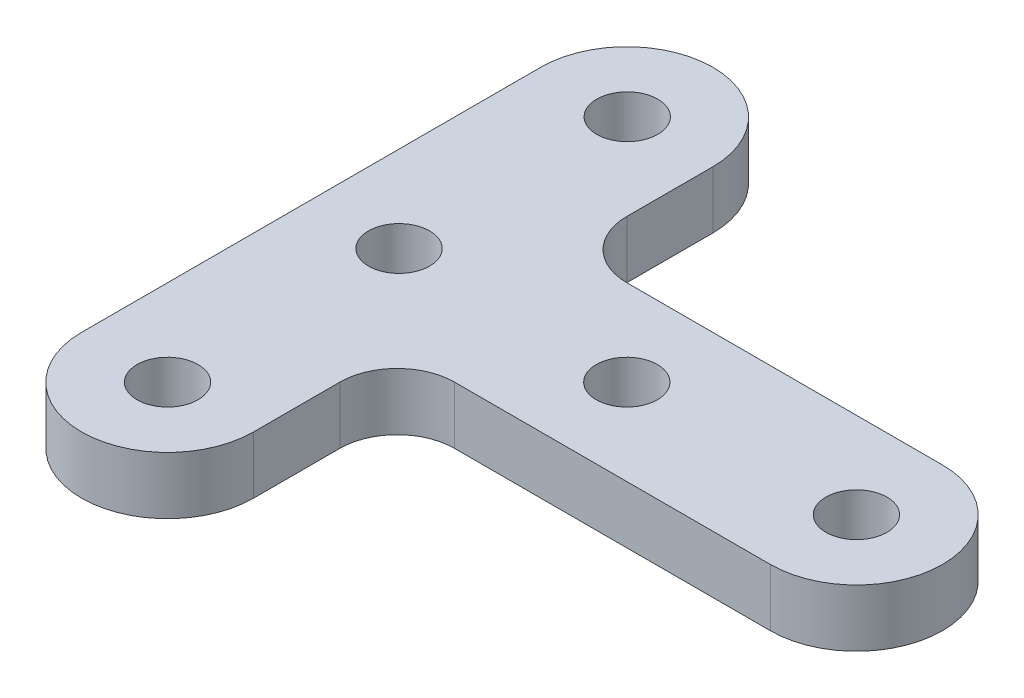
ISO-10303-21;
HEADER;
FILE_DESCRIPTION(('STEP AP214'),'2;1');
FILE_NAME('part.step','',(''),(''),'','','');
FILE_SCHEMA(('AUTOMOTIVE_DESIGN { 1 0 10303 214 1 1 1 1 }'));
ENDSEC;
DATA;
#1=APPLICATION_CONTEXT('core data for automotive mechanical design processes');
#2=APPLICATION_PROTOCOL_DEFINITION('international standard','automotive_design',2000,#1);
#3=PRODUCT_CONTEXT('',#1,'mechanical');
#4=PRODUCT('Part','Part','',(#3));
#5=PRODUCT_RELATED_PRODUCT_CATEGORY('part','',(#4));
#6=PRODUCT_DEFINITION_FORMATION('','',#4);
#7=PRODUCT_DEFINITION_CONTEXT('part definition',#1,'design');
#8=PRODUCT_DEFINITION('design','',#6,#7);
#9=PRODUCT_DEFINITION_SHAPE('','',#8);
#10=(LENGTH_UNIT() NAMED_UNIT(*) SI_UNIT(.MILLI.,.METRE.));
#11=(NAMED_UNIT(*) PLANE_ANGLE_UNIT() SI_UNIT($,.RADIAN.));
#12=(NAMED_UNIT(*) SI_UNIT($,.STERADIAN.) SOLID_ANGLE_UNIT());
#13=UNCERTAINTY_MEASURE_WITH_UNIT(LENGTH_MEASURE(1.E-05),#10,'distance_accuracy_value','');
#14=(GEOMETRIC_REPRESENTATION_CONTEXT(3) GLOBAL_UNCERTAINTY_ASSIGNED_CONTEXT((#13)) GLOBAL_UNIT_ASSIGNED_CONTEXT((#10,
#11,#12)) REPRESENTATION_CONTEXT('',''));
#15=CARTESIAN_POINT('',(0.,0.,0.));
#16=DIRECTION('',(0.,0.,1.));
#17=DIRECTION('',(1.,0.,0.));
#18=AXIS2_PLACEMENT_3D('',#15,#16,#17);
#19=CARTESIAN_POINT('',(-105.441812484,125.727574554,1122.100334154));
#20=DIRECTION('',(0.,0.,-1.));
#21=DIRECTION('',(1.,0.,0.));
#22=AXIS2_PLACEMENT_3D('',#19,#20,#21);
#23=PLANE('',#22);
#24=DIRECTION('',(1.,0.,0.));
#25=VECTOR('',#24,1.);
#26=CARTESIAN_POINT('',(-105.441812484,132.077574554,1122.100334154));
#27=LINE('',#26,#25);
#28=CARTESIAN_POINT('',(-99.0918124839999,132.077574554,1122.100334154));
#29=VERTEX_POINT('',#28);
#30=CARTESIAN_POINT('',(-64.1668124839999,132.077574554,1122.100334154));
#31=VERTEX_POINT('',#30);
#32=EDGE_CURVE('E219',#29,#31,#27,.T.);
#33=ORIENTED_EDGE('',*,*,#32,.F.);
#34=DIRECTION('',(0.,1.,0.));
#35=VECTOR('',#34,1.);
#36=CARTESIAN_POINT('',(-99.0918124839999,125.727574554,1122.100334154));
#37=LINE('',#36,#35);
#38=CARTESIAN_POINT('',(-99.0918124839999,125.727574554,1122.100334154));
#39=VERTEX_POINT('',#38);
#40=EDGE_CURVE('E54',#29,#39,#37,.F.);
#41=ORIENTED_EDGE('',*,*,#40,.T.);
#42=DIRECTION('',(1.,0.,0.));
#43=VECTOR('',#42,1.);
#44=CARTESIAN_POINT('',(-105.441812484,125.727574554,1122.100334154));
#45=LINE('',#44,#43);
#46=CARTESIAN_POINT('',(-64.1668124839999,125.727574554,1122.100334154));
#47=VERTEX_POINT('',#46);
#48=EDGE_CURVE('E112',#39,#47,#45,.T.);
#49=ORIENTED_EDGE('',*,*,#48,.T.);
#50=DIRECTION('',(0.,1.,0.));
#51=VECTOR('',#50,1.);
#52=CARTESIAN_POINT('',(-64.1668124839999,125.727574554,1122.100334154));
#53=LINE('',#52,#51);
#54=EDGE_CURVE('E115',#47,#31,#53,.T.);
#55=ORIENTED_EDGE('',*,*,#54,.T.);
#56=EDGE_LOOP('',(#33,#41,#49,#55));
#57=FACE_BOUND('',#56,.T.);
#58=ADVANCED_FACE('F39',(#57),#23,.F.);
#59=CARTESIAN_POINT('',(-64.1668124839999,125.727574554,1112.575334154));
#60=DIRECTION('',(0.,1.,0.));
#61=DIRECTION('',(0.,0.,1.));
#62=AXIS2_PLACEMENT_3D('',#59,#60,#61);
#63=CYLINDRICAL_SURFACE('',#62,9.52500000000001);
#64=CARTESIAN_POINT('',(-64.1668124839999,132.077574554,1112.575334154));
#65=DIRECTION('',(0.,1.,0.));
#66=DIRECTION('',(0.,0.,-1.));
#67=AXIS2_PLACEMENT_3D('',#64,#65,#66);
#68=CIRCLE('',#67,9.52500000000001);
#69=CARTESIAN_POINT('',(-64.1668124839999,132.077574554,1103.050334154));
#70=VERTEX_POINT('',#69);
#71=EDGE_CURVE('E132',#31,#70,#68,.T.);
#72=ORIENTED_EDGE('',*,*,#71,.F.);
#73=ORIENTED_EDGE('',*,*,#54,.F.);
#74=CARTESIAN_POINT('',(-64.1668124839999,125.727574554,1112.575334154));
#75=DIRECTION('',(0.,1.,0.));
#76=DIRECTION('',(0.,0.,-1.));
#77=AXIS2_PLACEMENT_3D('',#74,#75,#76);
#78=CIRCLE('',#77,9.52500000000001);
#79=CARTESIAN_POINT('',(-64.1668124839999,125.727574554,1103.050334154));
#80=VERTEX_POINT('',#79);
#81=EDGE_CURVE('E118',#47,#80,#78,.T.);
#82=ORIENTED_EDGE('',*,*,#81,.T.);
#83=DIRECTION('',(0.,1.,0.));
#84=VECTOR('',#83,1.);
#85=CARTESIAN_POINT('',(-64.1668124839999,125.727574554,1103.050334154));
#86=LINE('',#85,#84);
#87=EDGE_CURVE('E134',#80,#70,#86,.T.);
#88=ORIENTED_EDGE('',*,*,#87,.T.);
#89=EDGE_LOOP('',(#72,#73,#82,#88));
#90=FACE_BOUND('',#89,.T.);
#91=ADVANCED_FACE('F130',(#90),#63,.T.);
#92=CARTESIAN_POINT('',(-64.1668124839999,125.727574554,1103.050334154));
#93=DIRECTION('',(0.,0.,1.));
#94=DIRECTION('',(-1.,0.,0.));
#95=AXIS2_PLACEMENT_3D('',#92,#93,#94);
#96=PLANE('',#95);
#97=DIRECTION('',(-1.,0.,0.));
#98=VECTOR('',#97,1.);
#99=CARTESIAN_POINT('',(-64.1668124839999,125.727574554,1103.050334154));
#100=LINE('',#99,#98);
#101=CARTESIAN_POINT('',(-99.0918124839999,125.727574554,1103.050334154));
#102=VERTEX_POINT('',#101);
#103=EDGE_CURVE('E124',#80,#102,#100,.T.);
#104=ORIENTED_EDGE('',*,*,#103,.T.);
#105=DIRECTION('',(0.,1.,0.));
#106=VECTOR('',#105,1.);
#107=CARTESIAN_POINT('',(-99.0918124839999,132.077574554,1103.050334154));
#108=LINE('',#107,#106);
#109=CARTESIAN_POINT('',(-99.0918124839999,132.077574554,1103.050334154));
#110=VERTEX_POINT('',#109);
#111=EDGE_CURVE('E133',#102,#110,#108,.T.);
#112=ORIENTED_EDGE('',*,*,#111,.T.);
#113=DIRECTION('',(-1.,0.,0.));
#114=VECTOR('',#113,1.);
#115=CARTESIAN_POINT('',(-64.1668124839999,132.077574554,1103.050334154));
#116=LINE('',#115,#114);
#117=EDGE_CURVE('E168',#70,#110,#116,.T.);
#118=ORIENTED_EDGE('',*,*,#117,.F.);
#119=ORIENTED_EDGE('',*,*,#87,.F.);
#120=EDGE_LOOP('',(#104,#112,#118,#119));
#121=FACE_BOUND('',#120,.T.);
#122=ADVANCED_FACE('F159',(#121),#96,.F.);
#123=CARTESIAN_POINT('',(-105.441812484,125.727574554,1103.050334154));
#124=DIRECTION('',(-1.,0.,0.));
#125=DIRECTION('',(0.,0.,-1.));
#126=AXIS2_PLACEMENT_3D('',#123,#124,#125);
#127=PLANE('',#126);
#128=DIRECTION('',(0.,0.,-1.));
#129=VECTOR('',#128,1.);
#130=CARTESIAN_POINT('',(-105.441812484,132.077574554,1103.050334154));
#131=LINE('',#130,#129);
#132=CARTESIAN_POINT('',(-105.441812484,132.077574554,1096.700334154));
#133=VERTEX_POINT('',#132);
#134=CARTESIAN_POINT('',(-105.441812484,132.077574554,1087.175334154));
#135=VERTEX_POINT('',#134);
#136=EDGE_CURVE('E166',#133,#135,#131,.T.);
#137=ORIENTED_EDGE('',*,*,#136,.F.);
#138=DIRECTION('',(0.,1.,0.));
#139=VECTOR('',#138,1.);
#140=CARTESIAN_POINT('',(-105.441812484,125.727574554,1096.700334154));
#141=LINE('',#140,#139);
#142=CARTESIAN_POINT('',(-105.441812484,125.727574554,1096.700334154));
#143=VERTEX_POINT('',#142);
#144=EDGE_CURVE('E137',#133,#143,#141,.F.);
#145=ORIENTED_EDGE('',*,*,#144,.T.);
#146=DIRECTION('',(0.,0.,-1.));
#147=VECTOR('',#146,1.);
#148=CARTESIAN_POINT('',(-105.441812484,125.727574554,1103.050334154));
#149=LINE('',#148,#147);
#150=CARTESIAN_POINT('',(-105.441812484,125.727574554,1087.175334154));
#151=VERTEX_POINT('',#150);
#152=EDGE_CURVE('E154',#143,#151,#149,.T.);
#153=ORIENTED_EDGE('',*,*,#152,.T.);
#154=DIRECTION('',(0.,1.,0.));
#155=VECTOR('',#154,1.);
#156=CARTESIAN_POINT('',(-105.441812484,125.727574554,1087.175334154));
#157=LINE('',#156,#155);
#158=EDGE_CURVE('E139',#151,#135,#157,.T.);
#159=ORIENTED_EDGE('',*,*,#158,.T.);
#160=EDGE_LOOP('',(#137,#145,#153,#159));
#161=FACE_BOUND('',#160,.T.);
#162=ADVANCED_FACE('F171',(#161),#127,.F.);
#163=CARTESIAN_POINT('',(-114.966812484,125.727574554,1087.175334154));
#164=DIRECTION('',(0.,1.,0.));
#165=DIRECTION('',(0.,0.,1.));
#166=AXIS2_PLACEMENT_3D('',#163,#164,#165);
#167=CYLINDRICAL_SURFACE('',#166,9.52500000000006);
#168=CARTESIAN_POINT('',(-114.966812484,132.077574554,1087.175334154));
#169=DIRECTION('',(0.,1.,0.));
#170=DIRECTION('',(0.,0.,-1.));
#171=AXIS2_PLACEMENT_3D('',#168,#169,#170);
#172=CIRCLE('',#171,9.52500000000006);
#173=CARTESIAN_POINT('',(-124.491812484,132.077574554,1087.175334154));
#174=VERTEX_POINT('',#173);
#175=EDGE_CURVE('E173',#135,#174,#172,.T.);
#176=ORIENTED_EDGE('',*,*,#175,.F.);
#177=ORIENTED_EDGE('',*,*,#158,.F.);
#178=CARTESIAN_POINT('',(-114.966812484,125.727574554,1087.175334154));
#179=DIRECTION('',(0.,1.,0.));
#180=DIRECTION('',(0.,0.,-1.));
#181=AXIS2_PLACEMENT_3D('',#178,#179,#180);
#182=CIRCLE('',#181,9.52500000000006);
#183=CARTESIAN_POINT('',(-124.491812484,125.727574554,1087.175334154));
#184=VERTEX_POINT('',#183);
#185=EDGE_CURVE('E199',#151,#184,#182,.T.);
#186=ORIENTED_EDGE('',*,*,#185,.T.);
#187=DIRECTION('',(0.,1.,0.));
#188=VECTOR('',#187,1.);
#189=CARTESIAN_POINT('',(-124.491812484,125.727574554,1087.175334154));
#190=LINE('',#189,#188);
#191=EDGE_CURVE('E193',#184,#174,#190,.T.);
#192=ORIENTED_EDGE('',*,*,#191,.T.);
#193=EDGE_LOOP('',(#176,#177,#186,#192));
#194=FACE_BOUND('',#193,.T.);
#195=ADVANCED_FACE('F198',(#194),#167,.T.);
#196=CARTESIAN_POINT('',(-124.491812484,125.727574554,1137.975334154));
#197=DIRECTION('',(1.,0.,0.));
#198=DIRECTION('',(0.,0.,1.));
#199=AXIS2_PLACEMENT_3D('',#196,#197,#198);
#200=PLANE('',#199);
#201=DIRECTION('',(0.,0.,1.));
#202=VECTOR('',#201,1.);
#203=CARTESIAN_POINT('',(-124.491812484,132.077574554,1137.975334154));
#204=LINE('',#203,#202);
#205=CARTESIAN_POINT('',(-124.491812484,132.077574554,1137.975334154));
#206=VERTEX_POINT('',#205);
#207=EDGE_CURVE('E175',#174,#206,#204,.T.);
#208=ORIENTED_EDGE('',*,*,#207,.F.);
#209=ORIENTED_EDGE('',*,*,#191,.F.);
#210=DIRECTION('',(0.,0.,1.));
#211=VECTOR('',#210,1.);
#212=CARTESIAN_POINT('',(-124.491812484,125.727574554,1137.975334154));
#213=LINE('',#212,#211);
#214=CARTESIAN_POINT('',(-124.491812484,125.727574554,1137.975334154));
#215=VERTEX_POINT('',#214);
#216=EDGE_CURVE('E204',#184,#215,#213,.T.);
#217=ORIENTED_EDGE('',*,*,#216,.T.);
#218=DIRECTION('',(0.,1.,0.));
#219=VECTOR('',#218,1.);
#220=CARTESIAN_POINT('',(-124.491812484,125.727574554,1137.975334154));
#221=LINE('',#220,#219);
#222=EDGE_CURVE('E189',#215,#206,#221,.T.);
#223=ORIENTED_EDGE('',*,*,#222,.T.);
#224=EDGE_LOOP('',(#208,#209,#217,#223));
#225=FACE_BOUND('',#224,.T.);
#226=ADVANCED_FACE('F202',(#225),#200,.F.);
#227=CARTESIAN_POINT('',(-114.966812484,125.727574554,1137.975334154));
#228=DIRECTION('',(0.,1.,0.));
#229=DIRECTION('',(0.,0.,1.));
#230=AXIS2_PLACEMENT_3D('',#227,#228,#229);
#231=CYLINDRICAL_SURFACE('',#230,9.52500000000005);
#232=CARTESIAN_POINT('',(-114.966812484,132.077574554,1137.975334154));
#233=DIRECTION('',(0.,1.,0.));
#234=DIRECTION('',(0.,0.,-1.));
#235=AXIS2_PLACEMENT_3D('',#232,#233,#234);
#236=CIRCLE('',#235,9.52500000000005);
#237=CARTESIAN_POINT('',(-105.441812484,132.077574554,1137.975334154));
#238=VERTEX_POINT('',#237);
#239=EDGE_CURVE('E182',#206,#238,#236,.T.);
#240=ORIENTED_EDGE('',*,*,#239,.F.);
#241=ORIENTED_EDGE('',*,*,#222,.F.);
#242=CARTESIAN_POINT('',(-114.966812484,125.727574554,1137.975334154));
#243=DIRECTION('',(0.,1.,0.));
#244=DIRECTION('',(0.,0.,-1.));
#245=AXIS2_PLACEMENT_3D('',#242,#243,#244);
#246=CIRCLE('',#245,9.52500000000005);
#247=CARTESIAN_POINT('',(-105.441812484,125.727574554,1137.975334154));
#248=VERTEX_POINT('',#247);
#249=EDGE_CURVE('E208',#215,#248,#246,.T.);
#250=ORIENTED_EDGE('',*,*,#249,.T.);
#251=DIRECTION('',(0.,1.,0.));
#252=VECTOR('',#251,1.);
#253=CARTESIAN_POINT('',(-105.441812484,125.727574554,1137.975334154));
#254=LINE('',#253,#252);
#255=EDGE_CURVE('E186',#248,#238,#254,.T.);
#256=ORIENTED_EDGE('',*,*,#255,.T.);
#257=EDGE_LOOP('',(#240,#241,#250,#256));
#258=FACE_BOUND('',#257,.T.);
#259=ADVANCED_FACE('F207',(#258),#231,.T.);
#260=CARTESIAN_POINT('',(-105.441812484,125.727574554,1122.100334154));
#261=DIRECTION('',(-1.,0.,0.));
#262=DIRECTION('',(0.,0.,-1.));
#263=AXIS2_PLACEMENT_3D('',#260,#261,#262);
#264=PLANE('',#263);
#265=DIRECTION('',(0.,0.,-1.));
#266=VECTOR('',#265,1.);
#267=CARTESIAN_POINT('',(-105.441812484,125.727574554,1122.100334154));
#268=LINE('',#267,#266);
#269=CARTESIAN_POINT('',(-105.441812484,125.727574554,1128.450334154));
#270=VERTEX_POINT('',#269);
#271=EDGE_CURVE('E190',#248,#270,#268,.T.);
#272=ORIENTED_EDGE('',*,*,#271,.T.);
#273=DIRECTION('',(0.,1.,0.));
#274=VECTOR('',#273,1.);
#275=CARTESIAN_POINT('',(-105.441812484,132.077574554,1128.450334154));
#276=LINE('',#275,#274);
#277=CARTESIAN_POINT('',(-105.441812484,132.077574554,1128.450334154));
#278=VERTEX_POINT('',#277);
#279=EDGE_CURVE('E144',#270,#278,#276,.T.);
#280=ORIENTED_EDGE('',*,*,#279,.T.);
#281=DIRECTION('',(0.,0.,-1.));
#282=VECTOR('',#281,1.);
#283=CARTESIAN_POINT('',(-105.441812484,132.077574554,1122.100334154));
#284=LINE('',#283,#282);
#285=EDGE_CURVE('E119',#238,#278,#284,.T.);
#286=ORIENTED_EDGE('',*,*,#285,.F.);
#287=ORIENTED_EDGE('',*,*,#255,.F.);
#288=EDGE_LOOP('',(#272,#280,#286,#287));
#289=FACE_BOUND('',#288,.T.);
#290=ADVANCED_FACE('F212',(#289),#264,.F.);
#291=CARTESIAN_POINT('',(-64.1668124839999,125.727574554,1112.575334154));
#292=DIRECTION('',(0.,-1.,0.));
#293=DIRECTION('',(0.,0.,-1.));
#294=AXIS2_PLACEMENT_3D('',#291,#292,#293);
#295=PLANE('',#294);
#296=CARTESIAN_POINT('',(-114.966812484,125.727574554,1137.975334154));
#297=DIRECTION('',(0.,1.,0.));
#298=DIRECTION('',(0.,0.,-1.));
#299=AXIS2_PLACEMENT_3D('',#296,#297,#298);
#300=CIRCLE('',#299,3.37819999999998);
#301=CARTESIAN_POINT('',(-114.966812484,125.727574554,1134.597134154));
#302=VERTEX_POINT('',#301);
#303=EDGE_CURVE('E252',#302,#302,#300,.T.);
#304=ORIENTED_EDGE('',*,*,#303,.T.);
#305=EDGE_LOOP('',(#304));
#306=FACE_BOUND('',#305,.T.);
#307=CARTESIAN_POINT('',(-114.966812484,125.727574554,1112.36921109792));
#308=DIRECTION('',(0.,1.,0.));
#309=DIRECTION('',(0.,0.,-1.));
#310=AXIS2_PLACEMENT_3D('',#307,#308,#309);
#311=CIRCLE('',#310,3.37819999999998);
#312=CARTESIAN_POINT('',(-114.966812484,125.727574554,1108.99101109792));
#313=VERTEX_POINT('',#312);
#314=EDGE_CURVE('E246',#313,#313,#311,.T.);
#315=ORIENTED_EDGE('',*,*,#314,.T.);
#316=EDGE_LOOP('',(#315));
#317=FACE_BOUND('',#316,.T.);
#318=CARTESIAN_POINT('',(-114.966812484,125.727574554,1087.12884103348));
#319=DIRECTION('',(0.,1.,0.));
#320=DIRECTION('',(0.,0.,-1.));
#321=AXIS2_PLACEMENT_3D('',#318,#319,#320);
#322=CIRCLE('',#321,3.37819999999998);
#323=CARTESIAN_POINT('',(-114.966812484,125.727574554,1083.75064103348));
#324=VERTEX_POINT('',#323);
#325=EDGE_CURVE('E240',#324,#324,#322,.T.);
#326=ORIENTED_EDGE('',*,*,#325,.T.);
#327=EDGE_LOOP('',(#326));
#328=FACE_BOUND('',#327,.T.);
#329=CARTESIAN_POINT('',(-64.1668124839999,125.727574554,1112.575334154));
#330=DIRECTION('',(0.,1.,0.));
#331=DIRECTION('',(0.,0.,-1.));
#332=AXIS2_PLACEMENT_3D('',#329,#330,#331);
#333=CIRCLE('',#332,3.37819999999998);
#334=CARTESIAN_POINT('',(-64.1668124839999,125.727574554,1109.197134154));
#335=VERTEX_POINT('',#334);
#336=EDGE_CURVE('E234',#335,#335,#333,.T.);
#337=ORIENTED_EDGE('',*,*,#336,.T.);
#338=EDGE_LOOP('',(#337));
#339=FACE_BOUND('',#338,.T.);
#340=CARTESIAN_POINT('',(-89.566812484,125.727574554,1112.575334154));
#341=DIRECTION('',(0.,1.,0.));
#342=DIRECTION('',(0.,0.,-1.));
#343=AXIS2_PLACEMENT_3D('',#340,#341,#342);
#344=CIRCLE('',#343,3.37819999999998);
#345=CARTESIAN_POINT('',(-89.566812484,125.727574554,1109.197134154));
#346=VERTEX_POINT('',#345);
#347=EDGE_CURVE('E222',#346,#346,#344,.T.);
#348=ORIENTED_EDGE('',*,*,#347,.T.);
#349=EDGE_LOOP('',(#348));
#350=FACE_BOUND('',#349,.T.);
#351=ORIENTED_EDGE('',*,*,#48,.F.);
#352=CARTESIAN_POINT('',(-99.0918124839999,125.727574554,1128.450334154));
#353=DIRECTION('',(0.,-1.,0.));
#354=DIRECTION('',(0.,0.,-1.));
#355=AXIS2_PLACEMENT_3D('',#352,#353,#354);
#356=CIRCLE('',#355,6.35);
#357=EDGE_CURVE('E11',#39,#270,#356,.F.);
#358=ORIENTED_EDGE('',*,*,#357,.T.);
#359=ORIENTED_EDGE('',*,*,#271,.F.);
#360=ORIENTED_EDGE('',*,*,#249,.F.);
#361=ORIENTED_EDGE('',*,*,#216,.F.);
#362=ORIENTED_EDGE('',*,*,#185,.F.);
#363=ORIENTED_EDGE('',*,*,#152,.F.);
#364=CARTESIAN_POINT('',(-99.0918124839999,125.727574554,1096.700334154));
#365=DIRECTION('',(0.,-1.,0.));
#366=DIRECTION('',(0.,0.,-1.));
#367=AXIS2_PLACEMENT_3D('',#364,#365,#366);
#368=CIRCLE('',#367,6.35);
#369=EDGE_CURVE('E150',#143,#102,#368,.F.);
#370=ORIENTED_EDGE('',*,*,#369,.T.);
#371=ORIENTED_EDGE('',*,*,#103,.F.);
#372=ORIENTED_EDGE('',*,*,#81,.F.);
#373=EDGE_LOOP('',(#351,#358,#359,#360,#361,#362,#363,#370,#371,#372));
#374=FACE_BOUND('',#373,.T.);
#375=ADVANCED_FACE('F122',(#306,#317,#328,#339,#350,#374),#295,.T.);
#376=CARTESIAN_POINT('',(-64.1668124839999,132.077574554,1112.575334154));
#377=DIRECTION('',(0.,-1.,0.));
#378=DIRECTION('',(0.,0.,-1.));
#379=AXIS2_PLACEMENT_3D('',#376,#377,#378);
#380=PLANE('',#379);
#381=CARTESIAN_POINT('',(-114.966812484,132.077574554,1137.975334154));
#382=DIRECTION('',(0.,1.,0.));
#383=DIRECTION('',(0.,0.,-1.));
#384=AXIS2_PLACEMENT_3D('',#381,#382,#383);
#385=CIRCLE('',#384,3.3782);
#386=CARTESIAN_POINT('',(-114.966812484,132.077574554,1134.597134154));
#387=VERTEX_POINT('',#386);
#388=EDGE_CURVE('E249',#387,#387,#385,.T.);
#389=ORIENTED_EDGE('',*,*,#388,.F.);
#390=EDGE_LOOP('',(#389));
#391=FACE_BOUND('',#390,.T.);
#392=CARTESIAN_POINT('',(-114.966812484,132.077574554,1112.36921109792));
#393=DIRECTION('',(0.,1.,0.));
#394=DIRECTION('',(0.,0.,-1.));
#395=AXIS2_PLACEMENT_3D('',#392,#393,#394);
#396=CIRCLE('',#395,3.3782);
#397=CARTESIAN_POINT('',(-114.966812484,132.077574554,1108.99101109792));
#398=VERTEX_POINT('',#397);
#399=EDGE_CURVE('E243',#398,#398,#396,.T.);
#400=ORIENTED_EDGE('',*,*,#399,.F.);
#401=EDGE_LOOP('',(#400));
#402=FACE_BOUND('',#401,.T.);
#403=CARTESIAN_POINT('',(-114.966812484,132.077574554,1087.12884103348));
#404=DIRECTION('',(0.,1.,0.));
#405=DIRECTION('',(0.,0.,-1.));
#406=AXIS2_PLACEMENT_3D('',#403,#404,#405);
#407=CIRCLE('',#406,3.3782);
#408=CARTESIAN_POINT('',(-114.966812484,132.077574554,1083.75064103348));
#409=VERTEX_POINT('',#408);
#410=EDGE_CURVE('E237',#409,#409,#407,.T.);
#411=ORIENTED_EDGE('',*,*,#410,.F.);
#412=EDGE_LOOP('',(#411));
#413=FACE_BOUND('',#412,.T.);
#414=CARTESIAN_POINT('',(-64.1668124839999,132.077574554,1112.575334154));
#415=DIRECTION('',(0.,1.,0.));
#416=DIRECTION('',(0.,0.,-1.));
#417=AXIS2_PLACEMENT_3D('',#414,#415,#416);
#418=CIRCLE('',#417,3.3782);
#419=CARTESIAN_POINT('',(-64.1668124839999,132.077574554,1109.197134154));
#420=VERTEX_POINT('',#419);
#421=EDGE_CURVE('E227',#420,#420,#418,.T.);
#422=ORIENTED_EDGE('',*,*,#421,.F.);
#423=EDGE_LOOP('',(#422));
#424=FACE_BOUND('',#423,.T.);
#425=CARTESIAN_POINT('',(-89.566812484,132.077574554,1112.575334154));
#426=DIRECTION('',(0.,1.,0.));
#427=DIRECTION('',(0.,0.,-1.));
#428=AXIS2_PLACEMENT_3D('',#425,#426,#427);
#429=CIRCLE('',#428,3.3782);
#430=CARTESIAN_POINT('',(-89.566812484,132.077574554,1109.197134154));
#431=VERTEX_POINT('',#430);
#432=EDGE_CURVE('E220',#431,#431,#429,.T.);
#433=ORIENTED_EDGE('',*,*,#432,.F.);
#434=EDGE_LOOP('',(#433));
#435=FACE_BOUND('',#434,.T.);
#436=ORIENTED_EDGE('',*,*,#285,.T.);
#437=CARTESIAN_POINT('',(-99.0918124839999,132.077574554,1128.450334154));
#438=DIRECTION('',(0.,-1.,0.));
#439=DIRECTION('',(0.,0.,-1.));
#440=AXIS2_PLACEMENT_3D('',#437,#438,#439);
#441=CIRCLE('',#440,6.35);
#442=EDGE_CURVE('E47',#278,#29,#441,.T.);
#443=ORIENTED_EDGE('',*,*,#442,.T.);
#444=ORIENTED_EDGE('',*,*,#32,.T.);
#445=ORIENTED_EDGE('',*,*,#71,.T.);
#446=ORIENTED_EDGE('',*,*,#117,.T.);
#447=CARTESIAN_POINT('',(-99.0918124839999,132.077574554,1096.700334154));
#448=DIRECTION('',(0.,-1.,0.));
#449=DIRECTION('',(0.,0.,-1.));
#450=AXIS2_PLACEMENT_3D('',#447,#448,#449);
#451=CIRCLE('',#450,6.35);
#452=EDGE_CURVE('E148',#110,#133,#451,.T.);
#453=ORIENTED_EDGE('',*,*,#452,.T.);
#454=ORIENTED_EDGE('',*,*,#136,.T.);
#455=ORIENTED_EDGE('',*,*,#175,.T.);
#456=ORIENTED_EDGE('',*,*,#207,.T.);
#457=ORIENTED_EDGE('',*,*,#239,.T.);
#458=EDGE_LOOP('',(#436,#443,#444,#445,#446,#453,#454,#455,#456,#457));
#459=FACE_BOUND('',#458,.T.);
#460=ADVANCED_FACE('F164',(#391,#402,#413,#424,#435,#459),#380,.F.);
#461=CARTESIAN_POINT('',(-89.566812484,125.727574554,1112.575334154));
#462=DIRECTION('',(0.,-1.,0.));
#463=DIRECTION('',(0.,0.,-1.));
#464=AXIS2_PLACEMENT_3D('',#461,#462,#463);
#465=CYLINDRICAL_SURFACE('',#464,3.37819999999999);
#466=ORIENTED_EDGE('',*,*,#432,.T.);
#467=EDGE_LOOP('',(#466));
#468=FACE_BOUND('',#467,.T.);
#469=ORIENTED_EDGE('',*,*,#347,.F.);
#470=EDGE_LOOP('',(#469));
#471=FACE_BOUND('',#470,.T.);
#472=ADVANCED_FACE('F291',(#468,#471),#465,.F.);
#473=CARTESIAN_POINT('',(-64.1668124839999,125.727574554,1112.575334154));
#474=DIRECTION('',(0.,-1.,0.));
#475=DIRECTION('',(0.,0.,-1.));
#476=AXIS2_PLACEMENT_3D('',#473,#474,#475);
#477=CYLINDRICAL_SURFACE('',#476,3.37819999999999);
#478=ORIENTED_EDGE('',*,*,#421,.T.);
#479=EDGE_LOOP('',(#478));
#480=FACE_BOUND('',#479,.T.);
#481=ORIENTED_EDGE('',*,*,#336,.F.);
#482=EDGE_LOOP('',(#481));
#483=FACE_BOUND('',#482,.T.);
#484=ADVANCED_FACE('F297',(#480,#483),#477,.F.);
#485=CARTESIAN_POINT('',(-114.966812484,125.727574554,1087.12884103348));
#486=DIRECTION('',(0.,-1.,0.));
#487=DIRECTION('',(0.,0.,-1.));
#488=AXIS2_PLACEMENT_3D('',#485,#486,#487);
#489=CYLINDRICAL_SURFACE('',#488,3.37819999999999);
#490=ORIENTED_EDGE('',*,*,#410,.T.);
#491=EDGE_LOOP('',(#490));
#492=FACE_BOUND('',#491,.T.);
#493=ORIENTED_EDGE('',*,*,#325,.F.);
#494=EDGE_LOOP('',(#493));
#495=FACE_BOUND('',#494,.T.);
#496=ADVANCED_FACE('F268',(#492,#495),#489,.F.);
#497=CARTESIAN_POINT('',(-114.966812484,125.727574554,1112.36921109792));
#498=DIRECTION('',(0.,-1.,0.));
#499=DIRECTION('',(0.,0.,-1.));
#500=AXIS2_PLACEMENT_3D('',#497,#498,#499);
#501=CYLINDRICAL_SURFACE('',#500,3.37819999999999);
#502=ORIENTED_EDGE('',*,*,#399,.T.);
#503=EDGE_LOOP('',(#502));
#504=FACE_BOUND('',#503,.T.);
#505=ORIENTED_EDGE('',*,*,#314,.F.);
#506=EDGE_LOOP('',(#505));
#507=FACE_BOUND('',#506,.T.);
#508=ADVANCED_FACE('F260',(#504,#507),#501,.F.);
#509=CARTESIAN_POINT('',(-114.966812484,125.727574554,1137.975334154));
#510=DIRECTION('',(0.,-1.,0.));
#511=DIRECTION('',(0.,0.,-1.));
#512=AXIS2_PLACEMENT_3D('',#509,#510,#511);
#513=CYLINDRICAL_SURFACE('',#512,3.37819999999999);
#514=ORIENTED_EDGE('',*,*,#388,.T.);
#515=EDGE_LOOP('',(#514));
#516=FACE_BOUND('',#515,.T.);
#517=ORIENTED_EDGE('',*,*,#303,.F.);
#518=EDGE_LOOP('',(#517));
#519=FACE_BOUND('',#518,.T.);
#520=ADVANCED_FACE('F258',(#516,#519),#513,.F.);
#521=CARTESIAN_POINT('',(-99.0918124839999,125.727574554,1096.700334154));
#522=DIRECTION('',(0.,-1.,0.));
#523=DIRECTION('',(0.,0.,-1.));
#524=AXIS2_PLACEMENT_3D('',#521,#522,#523);
#525=CYLINDRICAL_SURFACE('',#524,6.35);
#526=ORIENTED_EDGE('',*,*,#369,.F.);
#527=ORIENTED_EDGE('',*,*,#144,.F.);
#528=ORIENTED_EDGE('',*,*,#452,.F.);
#529=ORIENTED_EDGE('',*,*,#111,.F.);
#530=EDGE_LOOP('',(#526,#527,#528,#529));
#531=FACE_BOUND('',#530,.T.);
#532=ADVANCED_FACE('F162',(#531),#525,.F.);
#533=CARTESIAN_POINT('',(-99.0918124839999,125.727574554,1128.450334154));
#534=DIRECTION('',(0.,-1.,0.));
#535=DIRECTION('',(0.,0.,-1.));
#536=AXIS2_PLACEMENT_3D('',#533,#534,#535);
#537=CYLINDRICAL_SURFACE('',#536,6.35);
#538=ORIENTED_EDGE('',*,*,#357,.F.);
#539=ORIENTED_EDGE('',*,*,#40,.F.);
#540=ORIENTED_EDGE('',*,*,#442,.F.);
#541=ORIENTED_EDGE('',*,*,#279,.F.);
#542=EDGE_LOOP('',(#538,#539,#540,#541));
#543=FACE_BOUND('',#542,.T.);
#544=ADVANCED_FACE('F41',(#543),#537,.F.);
#545=CLOSED_SHELL('',(#58,#91,#122,#162,#195,#226,#259,#290,#375,#460,#472,#484,#496,#508,#520,
#532,#544));
#546=MANIFOLD_SOLID_BREP('B2',#545);
#547=ADVANCED_BREP_SHAPE_REPRESENTATION('',(#18,#546),#14);
#548=SHAPE_DEFINITION_REPRESENTATION(#9,#547);
ENDSEC;
END-ISO-10303-21;
